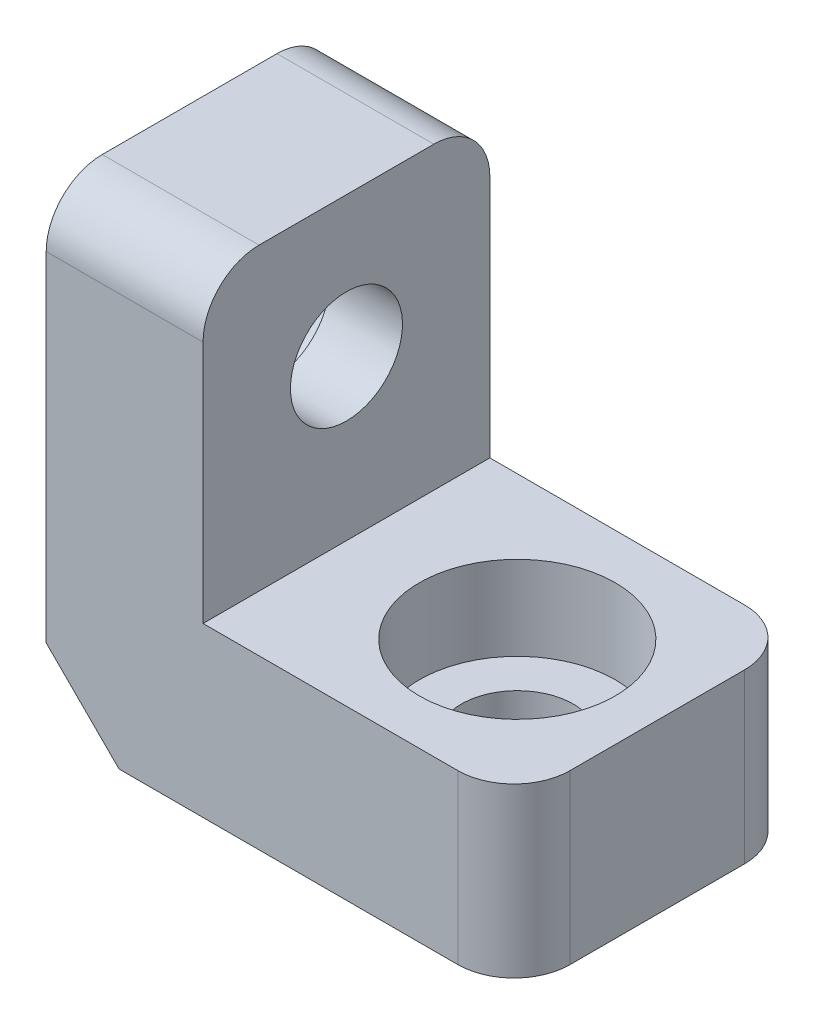
ISO-10303-21;
HEADER;
FILE_DESCRIPTION(('STEP AP214'),'2;1');
FILE_NAME('part.step','',(''),(''),'','','');
FILE_SCHEMA(('AUTOMOTIVE_DESIGN { 1 0 10303 214 1 1 1 1 }'));
ENDSEC;
DATA;
#1=APPLICATION_CONTEXT('core data for automotive mechanical design processes');
#2=APPLICATION_PROTOCOL_DEFINITION('international standard','automotive_design',2000,#1);
#3=PRODUCT_CONTEXT('',#1,'mechanical');
#4=PRODUCT('Part','Part','',(#3));
#5=PRODUCT_RELATED_PRODUCT_CATEGORY('part','',(#4));
#6=PRODUCT_DEFINITION_FORMATION('','',#4);
#7=PRODUCT_DEFINITION_CONTEXT('part definition',#1,'design');
#8=PRODUCT_DEFINITION('design','',#6,#7);
#9=PRODUCT_DEFINITION_SHAPE('','',#8);
#10=(LENGTH_UNIT() NAMED_UNIT(*) SI_UNIT(.MILLI.,.METRE.));
#11=(NAMED_UNIT(*) PLANE_ANGLE_UNIT() SI_UNIT($,.RADIAN.));
#12=(NAMED_UNIT(*) SI_UNIT($,.STERADIAN.) SOLID_ANGLE_UNIT());
#13=UNCERTAINTY_MEASURE_WITH_UNIT(LENGTH_MEASURE(1.E-05),#10,'distance_accuracy_value','');
#14=(GEOMETRIC_REPRESENTATION_CONTEXT(3) GLOBAL_UNCERTAINTY_ASSIGNED_CONTEXT((#13)) GLOBAL_UNIT_ASSIGNED_CONTEXT((#10,
#11,#12)) REPRESENTATION_CONTEXT('',''));
#15=CARTESIAN_POINT('',(0.,0.,0.));
#16=DIRECTION('',(0.,0.,1.));
#17=DIRECTION('',(1.,0.,0.));
#18=AXIS2_PLACEMENT_3D('',#15,#16,#17);
#19=CARTESIAN_POINT('',(2.8,3.,5.12));
#20=DIRECTION('',(0.,-1.,0.));
#21=DIRECTION('',(0.,0.,-1.));
#22=AXIS2_PLACEMENT_3D('',#19,#20,#21);
#23=PLANE('',#22);
#24=DIRECTION('',(0.,0.,-1.));
#25=VECTOR('',#24,1.);
#26=CARTESIAN_POINT('',(8.35,3.,5.12));
#27=LINE('',#26,#25);
#28=CARTESIAN_POINT('',(8.35,3.,4.12));
#29=VERTEX_POINT('',#28);
#30=CARTESIAN_POINT('',(8.35,3.,1.));
#31=VERTEX_POINT('',#30);
#32=EDGE_CURVE('E140',#29,#31,#27,.T.);
#33=ORIENTED_EDGE('',*,*,#32,.T.);
#34=CARTESIAN_POINT('',(7.35,3.,1.));
#35=DIRECTION('',(0.,-1.,0.));
#36=DIRECTION('',(0.,0.,-1.));
#37=AXIS2_PLACEMENT_3D('',#34,#35,#36);
#38=CIRCLE('',#37,1.);
#39=CARTESIAN_POINT('',(7.35,3.,0.));
#40=VERTEX_POINT('',#39);
#41=EDGE_CURVE('E204',#31,#40,#38,.F.);
#42=ORIENTED_EDGE('',*,*,#41,.T.);
#43=DIRECTION('',(-1.,0.,0.));
#44=VECTOR('',#43,1.);
#45=CARTESIAN_POINT('',(2.8,3.,0.));
#46=LINE('',#45,#44);
#47=CARTESIAN_POINT('',(2.8,3.,0.));
#48=VERTEX_POINT('',#47);
#49=EDGE_CURVE('E136',#40,#48,#46,.T.);
#50=ORIENTED_EDGE('',*,*,#49,.T.);
#51=DIRECTION('',(0.,0.,-1.));
#52=VECTOR('',#51,1.);
#53=CARTESIAN_POINT('',(2.8,3.,5.12));
#54=LINE('',#53,#52);
#55=CARTESIAN_POINT('',(2.8,3.,5.12));
#56=VERTEX_POINT('',#55);
#57=EDGE_CURVE('E132',#56,#48,#54,.T.);
#58=ORIENTED_EDGE('',*,*,#57,.F.);
#59=DIRECTION('',(-1.,0.,0.));
#60=VECTOR('',#59,1.);
#61=CARTESIAN_POINT('',(2.8,3.,5.12));
#62=LINE('',#61,#60);
#63=CARTESIAN_POINT('',(7.35,3.,5.12));
#64=VERTEX_POINT('',#63);
#65=EDGE_CURVE('E118',#64,#56,#62,.T.);
#66=ORIENTED_EDGE('',*,*,#65,.F.);
#67=CARTESIAN_POINT('',(7.35,3.,4.12));
#68=DIRECTION('',(0.,-1.,0.));
#69=DIRECTION('',(0.,0.,-1.));
#70=AXIS2_PLACEMENT_3D('',#67,#68,#69);
#71=CIRCLE('',#70,1.);
#72=EDGE_CURVE('E202',#64,#29,#71,.F.);
#73=ORIENTED_EDGE('',*,*,#72,.T.);
#74=EDGE_LOOP('',(#33,#42,#50,#58,#66,#73));
#75=FACE_BOUND('',#74,.T.);
#76=CARTESIAN_POINT('',(5.85,3.,2.56));
#77=DIRECTION('',(0.,1.,0.));
#78=DIRECTION('',(0.,0.,1.));
#79=AXIS2_PLACEMENT_3D('',#76,#77,#78);
#80=CIRCLE('',#79,1.75);
#81=CARTESIAN_POINT('',(5.85,3.,4.31));
#82=VERTEX_POINT('',#81);
#83=EDGE_CURVE('E270',#82,#82,#80,.T.);
#84=ORIENTED_EDGE('',*,*,#83,.F.);
#85=EDGE_LOOP('',(#84));
#86=FACE_BOUND('',#85,.T.);
#87=ADVANCED_FACE('F34',(#75,#86),#23,.F.);
#88=CARTESIAN_POINT('',(8.35,0.,5.12));
#89=DIRECTION('',(0.,1.,0.));
#90=DIRECTION('',(-1.,0.,0.));
#91=AXIS2_PLACEMENT_3D('',#88,#89,#90);
#92=PLANE('',#91);
#93=CARTESIAN_POINT('',(5.85,0.,2.56));
#94=DIRECTION('',(0.,1.,0.));
#95=DIRECTION('',(-1.,0.,0.));
#96=AXIS2_PLACEMENT_3D('',#93,#94,#95);
#97=CIRCLE('',#96,1.);
#98=CARTESIAN_POINT('',(4.85,0.,2.56));
#99=VERTEX_POINT('',#98);
#100=EDGE_CURVE('E155',#99,#99,#97,.T.);
#101=ORIENTED_EDGE('',*,*,#100,.T.);
#102=EDGE_LOOP('',(#101));
#103=FACE_BOUND('',#102,.T.);
#104=DIRECTION('',(1.,0.,0.));
#105=VECTOR('',#104,1.);
#106=CARTESIAN_POINT('',(8.35,0.,0.));
#107=LINE('',#106,#105);
#108=CARTESIAN_POINT('',(1.30000000000001,0.,0.));
#109=VERTEX_POINT('',#108);
#110=CARTESIAN_POINT('',(7.35,0.,0.));
#111=VERTEX_POINT('',#110);
#112=EDGE_CURVE('E153',#109,#111,#107,.T.);
#113=ORIENTED_EDGE('',*,*,#112,.T.);
#114=CARTESIAN_POINT('',(7.35,0.,1.));
#115=DIRECTION('',(0.,1.,0.));
#116=DIRECTION('',(-1.,0.,0.));
#117=AXIS2_PLACEMENT_3D('',#114,#115,#116);
#118=CIRCLE('',#117,1.);
#119=CARTESIAN_POINT('',(8.35,0.,1.));
#120=VERTEX_POINT('',#119);
#121=EDGE_CURVE('E11',#111,#120,#118,.F.);
#122=ORIENTED_EDGE('',*,*,#121,.T.);
#123=DIRECTION('',(0.,0.,-1.));
#124=VECTOR('',#123,1.);
#125=CARTESIAN_POINT('',(8.35,0.,5.12));
#126=LINE('',#125,#124);
#127=CARTESIAN_POINT('',(8.35,0.,4.12));
#128=VERTEX_POINT('',#127);
#129=EDGE_CURVE('E166',#128,#120,#126,.T.);
#130=ORIENTED_EDGE('',*,*,#129,.F.);
#131=CARTESIAN_POINT('',(7.35,0.,4.12));
#132=DIRECTION('',(0.,1.,0.));
#133=DIRECTION('',(-1.,0.,0.));
#134=AXIS2_PLACEMENT_3D('',#131,#132,#133);
#135=CIRCLE('',#134,1.);
#136=CARTESIAN_POINT('',(7.35,0.,5.12));
#137=VERTEX_POINT('',#136);
#138=EDGE_CURVE('E42',#128,#137,#135,.F.);
#139=ORIENTED_EDGE('',*,*,#138,.T.);
#140=DIRECTION('',(1.,0.,0.));
#141=VECTOR('',#140,1.);
#142=CARTESIAN_POINT('',(8.35,0.,5.12));
#143=LINE('',#142,#141);
#144=CARTESIAN_POINT('',(1.30000000000001,0.,5.12));
#145=VERTEX_POINT('',#144);
#146=EDGE_CURVE('E129',#145,#137,#143,.T.);
#147=ORIENTED_EDGE('',*,*,#146,.F.);
#148=DIRECTION('',(0.,0.,-1.));
#149=VECTOR('',#148,1.);
#150=CARTESIAN_POINT('',(1.30000000000001,0.,5.12));
#151=LINE('',#150,#149);
#152=EDGE_CURVE('E168',#145,#109,#151,.T.);
#153=ORIENTED_EDGE('',*,*,#152,.T.);
#154=EDGE_LOOP('',(#113,#122,#130,#139,#147,#153));
#155=FACE_BOUND('',#154,.T.);
#156=ADVANCED_FACE('F207',(#103,#155),#92,.F.);
#157=CARTESIAN_POINT('',(8.35,3.,5.12));
#158=DIRECTION('',(-1.,0.,0.));
#159=DIRECTION('',(0.,-1.,0.));
#160=AXIS2_PLACEMENT_3D('',#157,#158,#159);
#161=PLANE('',#160);
#162=ORIENTED_EDGE('',*,*,#129,.T.);
#163=DIRECTION('',(0.,1.,0.));
#164=VECTOR('',#163,1.);
#165=CARTESIAN_POINT('',(8.35,3.,1.));
#166=LINE('',#165,#164);
#167=EDGE_CURVE('E199',#120,#31,#166,.T.);
#168=ORIENTED_EDGE('',*,*,#167,.T.);
#169=ORIENTED_EDGE('',*,*,#32,.F.);
#170=DIRECTION('',(0.,1.,0.));
#171=VECTOR('',#170,1.);
#172=CARTESIAN_POINT('',(8.35,3.,4.12));
#173=LINE('',#172,#171);
#174=EDGE_CURVE('E54',#29,#128,#173,.F.);
#175=ORIENTED_EDGE('',*,*,#174,.T.);
#176=EDGE_LOOP('',(#162,#168,#169,#175));
#177=FACE_BOUND('',#176,.T.);
#178=ADVANCED_FACE('F211',(#177),#161,.F.);
#179=CARTESIAN_POINT('',(2.8,8.35,5.12));
#180=DIRECTION('',(-1.,0.,0.));
#181=DIRECTION('',(0.,-1.,0.));
#182=AXIS2_PLACEMENT_3D('',#179,#180,#181);
#183=PLANE('',#182);
#184=CARTESIAN_POINT('',(2.8,5.85,2.56));
#185=DIRECTION('',(-1.,0.,0.));
#186=DIRECTION('',(0.,-1.,0.));
#187=AXIS2_PLACEMENT_3D('',#184,#185,#186);
#188=CIRCLE('',#187,1.00000000000001);
#189=CARTESIAN_POINT('',(2.8,4.84999999999999,2.56));
#190=VERTEX_POINT('',#189);
#191=EDGE_CURVE('E268',#190,#190,#188,.T.);
#192=ORIENTED_EDGE('',*,*,#191,.T.);
#193=EDGE_LOOP('',(#192));
#194=FACE_BOUND('',#193,.T.);
#195=DIRECTION('',(0.,1.,0.));
#196=VECTOR('',#195,1.);
#197=CARTESIAN_POINT('',(2.8,8.35,0.));
#198=LINE('',#197,#196);
#199=CARTESIAN_POINT('',(2.8,7.35,0.));
#200=VERTEX_POINT('',#199);
#201=EDGE_CURVE('E157',#48,#200,#198,.T.);
#202=ORIENTED_EDGE('',*,*,#201,.T.);
#203=CARTESIAN_POINT('',(2.8,7.35,1.));
#204=DIRECTION('',(-1.,0.,0.));
#205=DIRECTION('',(0.,-1.,0.));
#206=AXIS2_PLACEMENT_3D('',#203,#204,#205);
#207=CIRCLE('',#206,1.);
#208=CARTESIAN_POINT('',(2.8,8.35,1.));
#209=VERTEX_POINT('',#208);
#210=EDGE_CURVE('E193',#200,#209,#207,.F.);
#211=ORIENTED_EDGE('',*,*,#210,.T.);
#212=DIRECTION('',(0.,0.,-1.));
#213=VECTOR('',#212,1.);
#214=CARTESIAN_POINT('',(2.8,8.35,5.12));
#215=LINE('',#214,#213);
#216=CARTESIAN_POINT('',(2.8,8.35,4.12));
#217=VERTEX_POINT('',#216);
#218=EDGE_CURVE('E141',#217,#209,#215,.T.);
#219=ORIENTED_EDGE('',*,*,#218,.F.);
#220=CARTESIAN_POINT('',(2.8,7.35,4.12));
#221=DIRECTION('',(-1.,0.,0.));
#222=DIRECTION('',(0.,-1.,0.));
#223=AXIS2_PLACEMENT_3D('',#220,#221,#222);
#224=CIRCLE('',#223,1.);
#225=CARTESIAN_POINT('',(2.8,7.35,5.12));
#226=VERTEX_POINT('',#225);
#227=EDGE_CURVE('E146',#217,#226,#224,.F.);
#228=ORIENTED_EDGE('',*,*,#227,.T.);
#229=DIRECTION('',(0.,1.,0.));
#230=VECTOR('',#229,1.);
#231=CARTESIAN_POINT('',(2.8,8.35,5.12));
#232=LINE('',#231,#230);
#233=EDGE_CURVE('E123',#56,#226,#232,.T.);
#234=ORIENTED_EDGE('',*,*,#233,.F.);
#235=ORIENTED_EDGE('',*,*,#57,.T.);
#236=EDGE_LOOP('',(#202,#211,#219,#228,#234,#235));
#237=FACE_BOUND('',#236,.T.);
#238=ADVANCED_FACE('F143',(#194,#237),#183,.F.);
#239=CARTESIAN_POINT('',(0.,8.35,5.12));
#240=DIRECTION('',(0.,-1.,0.));
#241=DIRECTION('',(0.,0.,-1.));
#242=AXIS2_PLACEMENT_3D('',#239,#240,#241);
#243=PLANE('',#242);
#244=ORIENTED_EDGE('',*,*,#218,.T.);
#245=DIRECTION('',(-1.,0.,0.));
#246=VECTOR('',#245,1.);
#247=CARTESIAN_POINT('',(0.,8.35,1.));
#248=LINE('',#247,#246);
#249=CARTESIAN_POINT('',(0.,8.35,1.));
#250=VERTEX_POINT('',#249);
#251=EDGE_CURVE('E181',#209,#250,#248,.T.);
#252=ORIENTED_EDGE('',*,*,#251,.T.);
#253=DIRECTION('',(0.,0.,-1.));
#254=VECTOR('',#253,1.);
#255=CARTESIAN_POINT('',(0.,8.35,5.12));
#256=LINE('',#255,#254);
#257=CARTESIAN_POINT('',(0.,8.35,4.12));
#258=VERTEX_POINT('',#257);
#259=EDGE_CURVE('E149',#258,#250,#256,.T.);
#260=ORIENTED_EDGE('',*,*,#259,.F.);
#261=DIRECTION('',(-1.,0.,0.));
#262=VECTOR('',#261,1.);
#263=CARTESIAN_POINT('',(0.,8.35,4.12));
#264=LINE('',#263,#262);
#265=EDGE_CURVE('E179',#258,#217,#264,.F.);
#266=ORIENTED_EDGE('',*,*,#265,.T.);
#267=EDGE_LOOP('',(#244,#252,#260,#266));
#268=FACE_BOUND('',#267,.T.);
#269=ADVANCED_FACE('F227',(#268),#243,.F.);
#270=CARTESIAN_POINT('',(0.,0.,5.12));
#271=DIRECTION('',(1.,0.,0.));
#272=DIRECTION('',(0.,0.,-1.));
#273=AXIS2_PLACEMENT_3D('',#270,#271,#272);
#274=PLANE('',#273);
#275=CARTESIAN_POINT('',(0.,5.85,2.56));
#276=DIRECTION('',(-1.,0.,0.));
#277=DIRECTION('',(0.,0.,1.));
#278=AXIS2_PLACEMENT_3D('',#275,#276,#277);
#279=CIRCLE('',#278,1.74999999999999);
#280=CARTESIAN_POINT('',(0.,5.85,4.31));
#281=VERTEX_POINT('',#280);
#282=EDGE_CURVE('E323',#281,#281,#279,.T.);
#283=ORIENTED_EDGE('',*,*,#282,.F.);
#284=EDGE_LOOP('',(#283));
#285=FACE_BOUND('',#284,.T.);
#286=ORIENTED_EDGE('',*,*,#259,.T.);
#287=CARTESIAN_POINT('',(0.,7.35,1.));
#288=DIRECTION('',(1.,0.,0.));
#289=DIRECTION('',(0.,0.,-1.));
#290=AXIS2_PLACEMENT_3D('',#287,#288,#289);
#291=CIRCLE('',#290,1.);
#292=CARTESIAN_POINT('',(0.,7.35,0.));
#293=VERTEX_POINT('',#292);
#294=EDGE_CURVE('E186',#250,#293,#291,.F.);
#295=ORIENTED_EDGE('',*,*,#294,.T.);
#296=DIRECTION('',(0.,-1.,0.));
#297=VECTOR('',#296,1.);
#298=CARTESIAN_POINT('',(0.,0.,0.));
#299=LINE('',#298,#297);
#300=CARTESIAN_POINT('',(0.,1.30000000000001,0.));
#301=VERTEX_POINT('',#300);
#302=EDGE_CURVE('E159',#293,#301,#299,.T.);
#303=ORIENTED_EDGE('',*,*,#302,.T.);
#304=DIRECTION('',(0.,0.,1.));
#305=VECTOR('',#304,1.);
#306=CARTESIAN_POINT('',(0.,1.30000000000001,5.12));
#307=LINE('',#306,#305);
#308=CARTESIAN_POINT('',(0.,1.30000000000001,5.12));
#309=VERTEX_POINT('',#308);
#310=EDGE_CURVE('E174',#301,#309,#307,.T.);
#311=ORIENTED_EDGE('',*,*,#310,.T.);
#312=DIRECTION('',(0.,-1.,0.));
#313=VECTOR('',#312,1.);
#314=CARTESIAN_POINT('',(0.,0.,5.12));
#315=LINE('',#314,#313);
#316=CARTESIAN_POINT('',(0.,7.35,5.12));
#317=VERTEX_POINT('',#316);
#318=EDGE_CURVE('E147',#317,#309,#315,.T.);
#319=ORIENTED_EDGE('',*,*,#318,.F.);
#320=CARTESIAN_POINT('',(0.,7.35,4.12));
#321=DIRECTION('',(1.,0.,0.));
#322=DIRECTION('',(0.,0.,-1.));
#323=AXIS2_PLACEMENT_3D('',#320,#321,#322);
#324=CIRCLE('',#323,1.);
#325=EDGE_CURVE('E184',#317,#258,#324,.F.);
#326=ORIENTED_EDGE('',*,*,#325,.T.);
#327=EDGE_LOOP('',(#286,#295,#303,#311,#319,#326));
#328=FACE_BOUND('',#327,.T.);
#329=ADVANCED_FACE('F230',(#285,#328),#274,.F.);
#330=CARTESIAN_POINT('',(0.,0.,5.12));
#331=DIRECTION('',(0.,0.,-1.));
#332=DIRECTION('',(-1.,0.,0.));
#333=AXIS2_PLACEMENT_3D('',#330,#331,#332);
#334=PLANE('',#333);
#335=ORIENTED_EDGE('',*,*,#233,.T.);
#336=DIRECTION('',(-1.,0.,0.));
#337=VECTOR('',#336,1.);
#338=CARTESIAN_POINT('',(0.,7.35,5.12));
#339=LINE('',#338,#337);
#340=EDGE_CURVE('E196',#226,#317,#339,.T.);
#341=ORIENTED_EDGE('',*,*,#340,.T.);
#342=ORIENTED_EDGE('',*,*,#318,.T.);
#343=DIRECTION('',(-0.707106781186548,0.707106781186548,0.));
#344=VECTOR('',#343,1.);
#345=CARTESIAN_POINT('',(1.30000000000001,0.,5.12));
#346=LINE('',#345,#344);
#347=EDGE_CURVE('E177',#309,#145,#346,.F.);
#348=ORIENTED_EDGE('',*,*,#347,.T.);
#349=ORIENTED_EDGE('',*,*,#146,.T.);
#350=DIRECTION('',(0.,1.,0.));
#351=VECTOR('',#350,1.);
#352=CARTESIAN_POINT('',(7.35,0.,5.12));
#353=LINE('',#352,#351);
#354=EDGE_CURVE('E127',#137,#64,#353,.T.);
#355=ORIENTED_EDGE('',*,*,#354,.T.);
#356=ORIENTED_EDGE('',*,*,#65,.T.);
#357=EDGE_LOOP('',(#335,#341,#342,#348,#349,#355,#356));
#358=FACE_BOUND('',#357,.T.);
#359=ADVANCED_FACE('F120',(#358),#334,.F.);
#360=CARTESIAN_POINT('',(0.,0.,0.));
#361=DIRECTION('',(0.,0.,-1.));
#362=DIRECTION('',(-1.,0.,0.));
#363=AXIS2_PLACEMENT_3D('',#360,#361,#362);
#364=PLANE('',#363);
#365=ORIENTED_EDGE('',*,*,#302,.F.);
#366=DIRECTION('',(-1.,0.,0.));
#367=VECTOR('',#366,1.);
#368=CARTESIAN_POINT('',(2.8,7.35,0.));
#369=LINE('',#368,#367);
#370=EDGE_CURVE('E190',#293,#200,#369,.F.);
#371=ORIENTED_EDGE('',*,*,#370,.T.);
#372=ORIENTED_EDGE('',*,*,#201,.F.);
#373=ORIENTED_EDGE('',*,*,#49,.F.);
#374=DIRECTION('',(0.,1.,0.));
#375=VECTOR('',#374,1.);
#376=CARTESIAN_POINT('',(7.35,0.,0.));
#377=LINE('',#376,#375);
#378=EDGE_CURVE('E188',#40,#111,#377,.F.);
#379=ORIENTED_EDGE('',*,*,#378,.T.);
#380=ORIENTED_EDGE('',*,*,#112,.F.);
#381=DIRECTION('',(0.707106781186548,-0.707106781186548,0.));
#382=VECTOR('',#381,1.);
#383=CARTESIAN_POINT('',(0.650000000000003,0.650000000000003,0.));
#384=LINE('',#383,#382);
#385=EDGE_CURVE('E171',#109,#301,#384,.F.);
#386=ORIENTED_EDGE('',*,*,#385,.T.);
#387=EDGE_LOOP('',(#365,#371,#372,#373,#379,#380,#386));
#388=FACE_BOUND('',#387,.T.);
#389=ADVANCED_FACE('F218',(#388),#364,.T.);
#390=CARTESIAN_POINT('',(5.85,3.,2.56));
#391=DIRECTION('',(0.,1.,0.));
#392=DIRECTION('',(0.,0.,1.));
#393=AXIS2_PLACEMENT_3D('',#390,#391,#392);
#394=CYLINDRICAL_SURFACE('',#393,1.);
#395=ORIENTED_EDGE('',*,*,#100,.F.);
#396=EDGE_LOOP('',(#395));
#397=FACE_BOUND('',#396,.T.);
#398=CARTESIAN_POINT('',(5.85,1.5,2.56));
#399=DIRECTION('',(0.,1.,0.));
#400=DIRECTION('',(0.,0.,1.));
#401=AXIS2_PLACEMENT_3D('',#398,#399,#400);
#402=CIRCLE('',#401,1.);
#403=CARTESIAN_POINT('',(5.85,1.5,3.56));
#404=VERTEX_POINT('',#403);
#405=EDGE_CURVE('E283',#404,#404,#402,.T.);
#406=ORIENTED_EDGE('',*,*,#405,.T.);
#407=EDGE_LOOP('',(#406));
#408=FACE_BOUND('',#407,.T.);
#409=ADVANCED_FACE('F289',(#397,#408),#394,.F.);
#410=CARTESIAN_POINT('',(6.85,1.5,2.56));
#411=DIRECTION('',(0.,-1.,0.));
#412=DIRECTION('',(0.,0.,-1.));
#413=AXIS2_PLACEMENT_3D('',#410,#411,#412);
#414=PLANE('',#413);
#415=ORIENTED_EDGE('',*,*,#405,.F.);
#416=EDGE_LOOP('',(#415));
#417=FACE_BOUND('',#416,.T.);
#418=CARTESIAN_POINT('',(5.85,1.5,2.56));
#419=DIRECTION('',(0.,1.,0.));
#420=DIRECTION('',(0.,0.,1.));
#421=AXIS2_PLACEMENT_3D('',#418,#419,#420);
#422=CIRCLE('',#421,1.75);
#423=CARTESIAN_POINT('',(5.85,1.5,4.31));
#424=VERTEX_POINT('',#423);
#425=EDGE_CURVE('E274',#424,#424,#422,.T.);
#426=ORIENTED_EDGE('',*,*,#425,.T.);
#427=EDGE_LOOP('',(#426));
#428=FACE_BOUND('',#427,.T.);
#429=ADVANCED_FACE('F292',(#417,#428),#414,.F.);
#430=CARTESIAN_POINT('',(5.85,3.,2.56));
#431=DIRECTION('',(0.,1.,0.));
#432=DIRECTION('',(0.,0.,1.));
#433=AXIS2_PLACEMENT_3D('',#430,#431,#432);
#434=CYLINDRICAL_SURFACE('',#433,1.75);
#435=ORIENTED_EDGE('',*,*,#425,.F.);
#436=EDGE_LOOP('',(#435));
#437=FACE_BOUND('',#436,.T.);
#438=ORIENTED_EDGE('',*,*,#83,.T.);
#439=EDGE_LOOP('',(#438));
#440=FACE_BOUND('',#439,.T.);
#441=ADVANCED_FACE('F298',(#437,#440),#434,.F.);
#442=CARTESIAN_POINT('',(0.,5.85,2.56));
#443=DIRECTION('',(-1.,0.,0.));
#444=DIRECTION('',(0.,0.,1.));
#445=AXIS2_PLACEMENT_3D('',#442,#443,#444);
#446=CYLINDRICAL_SURFACE('',#445,1.00000000000001);
#447=ORIENTED_EDGE('',*,*,#191,.F.);
#448=EDGE_LOOP('',(#447));
#449=FACE_BOUND('',#448,.T.);
#450=CARTESIAN_POINT('',(1.5,5.85,2.56));
#451=DIRECTION('',(-1.,0.,0.));
#452=DIRECTION('',(0.,0.,1.));
#453=AXIS2_PLACEMENT_3D('',#450,#451,#452);
#454=CIRCLE('',#453,1.00000000000001);
#455=CARTESIAN_POINT('',(1.5,5.85,3.56000000000001));
#456=VERTEX_POINT('',#455);
#457=EDGE_CURVE('E271',#456,#456,#454,.T.);
#458=ORIENTED_EDGE('',*,*,#457,.T.);
#459=EDGE_LOOP('',(#458));
#460=FACE_BOUND('',#459,.T.);
#461=ADVANCED_FACE('F304',(#449,#460),#446,.F.);
#462=CARTESIAN_POINT('',(1.5,6.85000000000001,2.56));
#463=DIRECTION('',(1.,0.,0.));
#464=DIRECTION('',(0.,0.,-1.));
#465=AXIS2_PLACEMENT_3D('',#462,#463,#464);
#466=PLANE('',#465);
#467=ORIENTED_EDGE('',*,*,#457,.F.);
#468=EDGE_LOOP('',(#467));
#469=FACE_BOUND('',#468,.T.);
#470=CARTESIAN_POINT('',(1.5,5.85,2.56));
#471=DIRECTION('',(-1.,0.,0.));
#472=DIRECTION('',(0.,0.,1.));
#473=AXIS2_PLACEMENT_3D('',#470,#471,#472);
#474=CIRCLE('',#473,1.74999999999999);
#475=CARTESIAN_POINT('',(1.5,5.85,4.31));
#476=VERTEX_POINT('',#475);
#477=EDGE_CURVE('E277',#476,#476,#474,.T.);
#478=ORIENTED_EDGE('',*,*,#477,.T.);
#479=EDGE_LOOP('',(#478));
#480=FACE_BOUND('',#479,.T.);
#481=ADVANCED_FACE('F245',(#469,#480),#466,.F.);
#482=CARTESIAN_POINT('',(0.,5.85,2.56));
#483=DIRECTION('',(-1.,0.,0.));
#484=DIRECTION('',(0.,0.,1.));
#485=AXIS2_PLACEMENT_3D('',#482,#483,#484);
#486=CYLINDRICAL_SURFACE('',#485,1.74999999999999);
#487=ORIENTED_EDGE('',*,*,#477,.F.);
#488=EDGE_LOOP('',(#487));
#489=FACE_BOUND('',#488,.T.);
#490=ORIENTED_EDGE('',*,*,#282,.T.);
#491=EDGE_LOOP('',(#490));
#492=FACE_BOUND('',#491,.T.);
#493=ADVANCED_FACE('F238',(#489,#492),#486,.F.);
#494=CARTESIAN_POINT('',(1.30000000000001,0.,5.12));
#495=DIRECTION('',(0.707106781186548,0.707106781186548,0.));
#496=DIRECTION('',(0.,0.,-1.));
#497=AXIS2_PLACEMENT_3D('',#494,#495,#496);
#498=PLANE('',#497);
#499=ORIENTED_EDGE('',*,*,#347,.F.);
#500=ORIENTED_EDGE('',*,*,#310,.F.);
#501=ORIENTED_EDGE('',*,*,#385,.F.);
#502=ORIENTED_EDGE('',*,*,#152,.F.);
#503=EDGE_LOOP('',(#499,#500,#501,#502));
#504=FACE_BOUND('',#503,.T.);
#505=ADVANCED_FACE('F236',(#504),#498,.F.);
#506=CARTESIAN_POINT('',(0.,7.35,1.));
#507=DIRECTION('',(1.,0.,0.));
#508=DIRECTION('',(0.,0.,-1.));
#509=AXIS2_PLACEMENT_3D('',#506,#507,#508);
#510=CYLINDRICAL_SURFACE('',#509,1.);
#511=ORIENTED_EDGE('',*,*,#210,.F.);
#512=ORIENTED_EDGE('',*,*,#370,.F.);
#513=ORIENTED_EDGE('',*,*,#294,.F.);
#514=ORIENTED_EDGE('',*,*,#251,.F.);
#515=EDGE_LOOP('',(#511,#512,#513,#514));
#516=FACE_BOUND('',#515,.T.);
#517=ADVANCED_FACE('F224',(#516),#510,.T.);
#518=CARTESIAN_POINT('',(0.,7.35,4.12));
#519=DIRECTION('',(-1.,0.,0.));
#520=DIRECTION('',(0.,0.,1.));
#521=AXIS2_PLACEMENT_3D('',#518,#519,#520);
#522=CYLINDRICAL_SURFACE('',#521,1.);
#523=ORIENTED_EDGE('',*,*,#227,.F.);
#524=ORIENTED_EDGE('',*,*,#265,.F.);
#525=ORIENTED_EDGE('',*,*,#325,.F.);
#526=ORIENTED_EDGE('',*,*,#340,.F.);
#527=EDGE_LOOP('',(#523,#524,#525,#526));
#528=FACE_BOUND('',#527,.T.);
#529=ADVANCED_FACE('F233',(#528),#522,.T.);
#530=CARTESIAN_POINT('',(7.35,3.,1.));
#531=DIRECTION('',(0.,-1.,0.));
#532=DIRECTION('',(1.,0.,0.));
#533=AXIS2_PLACEMENT_3D('',#530,#531,#532);
#534=CYLINDRICAL_SURFACE('',#533,1.);
#535=ORIENTED_EDGE('',*,*,#121,.F.);
#536=ORIENTED_EDGE('',*,*,#378,.F.);
#537=ORIENTED_EDGE('',*,*,#41,.F.);
#538=ORIENTED_EDGE('',*,*,#167,.F.);
#539=EDGE_LOOP('',(#535,#536,#537,#538));
#540=FACE_BOUND('',#539,.T.);
#541=ADVANCED_FACE('F214',(#540),#534,.T.);
#542=CARTESIAN_POINT('',(7.35,0.,4.12));
#543=DIRECTION('',(0.,1.,0.));
#544=DIRECTION('',(-1.,0.,0.));
#545=AXIS2_PLACEMENT_3D('',#542,#543,#544);
#546=CYLINDRICAL_SURFACE('',#545,1.);
#547=ORIENTED_EDGE('',*,*,#138,.F.);
#548=ORIENTED_EDGE('',*,*,#174,.F.);
#549=ORIENTED_EDGE('',*,*,#72,.F.);
#550=ORIENTED_EDGE('',*,*,#354,.F.);
#551=EDGE_LOOP('',(#547,#548,#549,#550));
#552=FACE_BOUND('',#551,.T.);
#553=ADVANCED_FACE('F36',(#552),#546,.T.);
#554=CLOSED_SHELL('',(#87,#156,#178,#238,#269,#329,#359,#389,#409,#429,#441,#461,#481,#493,#505,
#517,#529,#541,#553));
#555=MANIFOLD_SOLID_BREP('B2',#554);
#556=ADVANCED_BREP_SHAPE_REPRESENTATION('',(#18,#555),#14);
#557=SHAPE_DEFINITION_REPRESENTATION(#9,#556);
ENDSEC;
END-ISO-10303-21;
